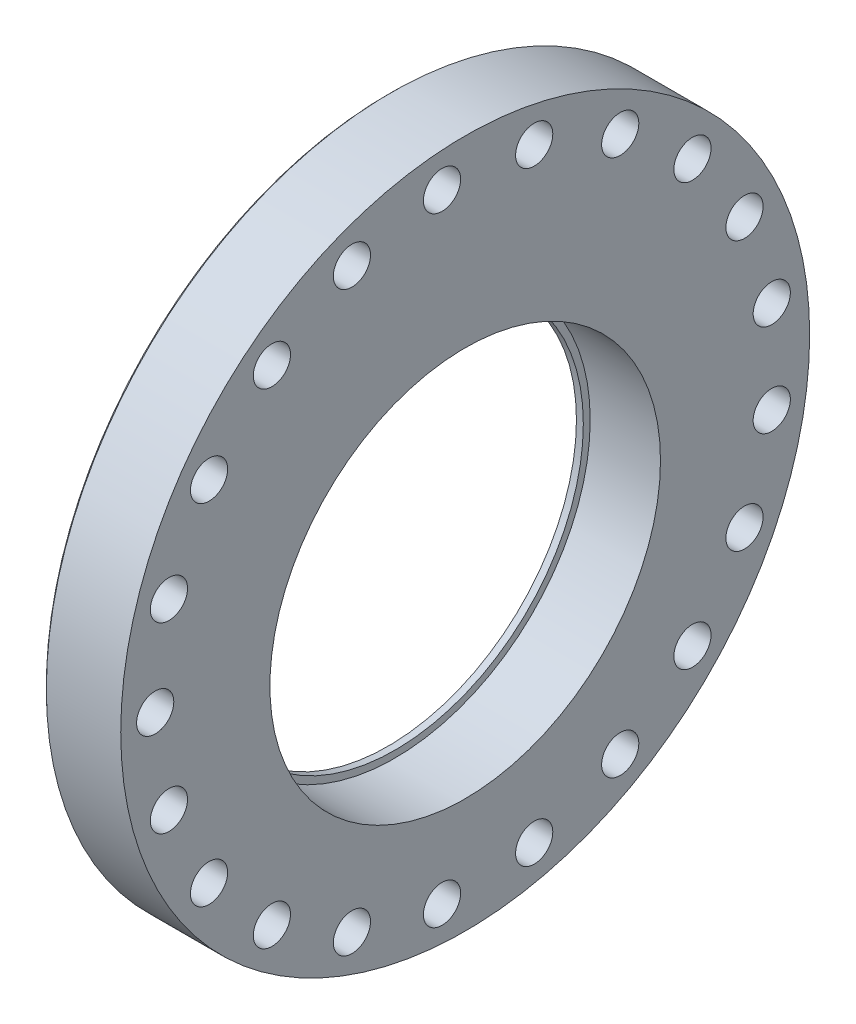
ISO-10303-21;
HEADER;
FILE_DESCRIPTION(('STEP AP214'),'2;1');
FILE_NAME('part.step','',(''),(''),'','','');
FILE_SCHEMA(('AUTOMOTIVE_DESIGN { 1 0 10303 214 1 1 1 1 }'));
ENDSEC;
DATA;
#1=APPLICATION_CONTEXT('core data for automotive mechanical design processes');
#2=APPLICATION_PROTOCOL_DEFINITION('international standard','automotive_design',2000,#1);
#3=PRODUCT_CONTEXT('',#1,'mechanical');
#4=PRODUCT('Part','Part','',(#3));
#5=PRODUCT_RELATED_PRODUCT_CATEGORY('part','',(#4));
#6=PRODUCT_DEFINITION_FORMATION('','',#4);
#7=PRODUCT_DEFINITION_CONTEXT('part definition',#1,'design');
#8=PRODUCT_DEFINITION('design','',#6,#7);
#9=PRODUCT_DEFINITION_SHAPE('','',#8);
#10=(LENGTH_UNIT() NAMED_UNIT(*) SI_UNIT(.MILLI.,.METRE.));
#11=(NAMED_UNIT(*) PLANE_ANGLE_UNIT() SI_UNIT($,.RADIAN.));
#12=(NAMED_UNIT(*) SI_UNIT($,.STERADIAN.) SOLID_ANGLE_UNIT());
#13=UNCERTAINTY_MEASURE_WITH_UNIT(LENGTH_MEASURE(1.E-05),#10,'distance_accuracy_value','');
#14=(GEOMETRIC_REPRESENTATION_CONTEXT(3) GLOBAL_UNCERTAINTY_ASSIGNED_CONTEXT((#13)) GLOBAL_UNIT_ASSIGNED_CONTEXT((#10,
#11,#12)) REPRESENTATION_CONTEXT('',''));
#15=CARTESIAN_POINT('',(0.,0.,0.));
#16=DIRECTION('',(0.,0.,1.));
#17=DIRECTION('',(1.,0.,0.));
#18=AXIS2_PLACEMENT_3D('',#15,#16,#17);
#19=CARTESIAN_POINT('',(14.224,227.166574262267,-762.669738747229));
#20=DIRECTION('',(-1.,0.,0.));
#21=DIRECTION('',(0.,0.,1.));
#22=AXIS2_PLACEMENT_3D('',#19,#20,#21);
#23=CYLINDRICAL_SURFACE('',#22,3.429);
#24=CARTESIAN_POINT('',(14.224,227.166574262267,-762.669738747229));
#25=DIRECTION('',(1.,0.,0.));
#26=DIRECTION('',(0.,0.,-1.));
#27=AXIS2_PLACEMENT_3D('',#24,#25,#26);
#28=CIRCLE('',#27,3.429);
#29=CARTESIAN_POINT('',(14.224,227.166574262267,-766.098738747229));
#30=VERTEX_POINT('',#29);
#31=EDGE_CURVE('E158',#30,#30,#28,.T.);
#32=ORIENTED_EDGE('',*,*,#31,.T.);
#33=EDGE_LOOP('',(#32));
#34=FACE_BOUND('',#33,.T.);
#35=CARTESIAN_POINT('',(0.,227.166574262267,-762.669738747229));
#36=DIRECTION('',(1.,0.,0.));
#37=DIRECTION('',(0.,0.,-1.));
#38=AXIS2_PLACEMENT_3D('',#35,#36,#37);
#39=CIRCLE('',#38,3.429);
#40=CARTESIAN_POINT('',(0.,227.166574262267,-766.098738747229));
#41=VERTEX_POINT('',#40);
#42=EDGE_CURVE('E69',#41,#41,#39,.T.);
#43=ORIENTED_EDGE('',*,*,#42,.F.);
#44=EDGE_LOOP('',(#43));
#45=FACE_BOUND('',#44,.T.);
#46=ADVANCED_FACE('F45',(#34,#45),#23,.F.);
#47=CARTESIAN_POINT('',(14.224,244.01183247985,-765.208752896551));
#48=DIRECTION('',(-1.,0.,0.));
#49=DIRECTION('',(0.,0.,1.));
#50=AXIS2_PLACEMENT_3D('',#47,#48,#49);
#51=CYLINDRICAL_SURFACE('',#50,3.42899999999977);
#52=CARTESIAN_POINT('',(14.224,244.01183247985,-765.208752896551));
#53=DIRECTION('',(1.,0.,0.));
#54=DIRECTION('',(0.,0.,-1.));
#55=AXIS2_PLACEMENT_3D('',#52,#53,#54);
#56=CIRCLE('',#55,3.42899999999977);
#57=CARTESIAN_POINT('',(14.224,244.01183247985,-768.637752896551));
#58=VERTEX_POINT('',#57);
#59=EDGE_CURVE('E162',#58,#58,#56,.T.);
#60=ORIENTED_EDGE('',*,*,#59,.T.);
#61=EDGE_LOOP('',(#60));
#62=FACE_BOUND('',#61,.T.);
#63=CARTESIAN_POINT('',(0.,244.01183247985,-765.208752896551));
#64=DIRECTION('',(1.,0.,0.));
#65=DIRECTION('',(0.,0.,-1.));
#66=AXIS2_PLACEMENT_3D('',#63,#64,#65);
#67=CIRCLE('',#66,3.42899999999977);
#68=CARTESIAN_POINT('',(0.,244.01183247985,-768.637752896551));
#69=VERTEX_POINT('',#68);
#70=EDGE_CURVE('E74',#69,#69,#67,.T.);
#71=ORIENTED_EDGE('',*,*,#70,.F.);
#72=EDGE_LOOP('',(#71));
#73=FACE_BOUND('',#72,.T.);
#74=ADVANCED_FACE('F266',(#62,#73),#51,.F.);
#75=CARTESIAN_POINT('',(14.224,259.360315580603,-772.60019279507));
#76=DIRECTION('',(-1.,0.,0.));
#77=DIRECTION('',(0.,0.,1.));
#78=AXIS2_PLACEMENT_3D('',#75,#76,#77);
#79=CYLINDRICAL_SURFACE('',#78,3.429);
#80=CARTESIAN_POINT('',(14.224,259.360315580603,-772.60019279507));
#81=DIRECTION('',(1.,0.,0.));
#82=DIRECTION('',(0.,0.,-1.));
#83=AXIS2_PLACEMENT_3D('',#80,#81,#82);
#84=CIRCLE('',#83,3.429);
#85=CARTESIAN_POINT('',(14.224,259.360315580603,-776.02919279507));
#86=VERTEX_POINT('',#85);
#87=EDGE_CURVE('E166',#86,#86,#84,.T.);
#88=ORIENTED_EDGE('',*,*,#87,.T.);
#89=EDGE_LOOP('',(#88));
#90=FACE_BOUND('',#89,.T.);
#91=CARTESIAN_POINT('',(0.,259.360315580603,-772.60019279507));
#92=DIRECTION('',(1.,0.,0.));
#93=DIRECTION('',(0.,0.,-1.));
#94=AXIS2_PLACEMENT_3D('',#91,#92,#93);
#95=CIRCLE('',#94,3.429);
#96=CARTESIAN_POINT('',(0.,259.360315580603,-776.02919279507));
#97=VERTEX_POINT('',#96);
#98=EDGE_CURVE('E78',#97,#97,#95,.T.);
#99=ORIENTED_EDGE('',*,*,#98,.F.);
#100=EDGE_LOOP('',(#99));
#101=FACE_BOUND('',#100,.T.);
#102=ADVANCED_FACE('F273',(#90,#101),#79,.F.);
#103=CARTESIAN_POINT('',(14.224,271.848243485315,-784.187296571003));
#104=DIRECTION('',(-1.,0.,0.));
#105=DIRECTION('',(0.,0.,1.));
#106=AXIS2_PLACEMENT_3D('',#103,#104,#105);
#107=CYLINDRICAL_SURFACE('',#106,3.42900000000023);
#108=CARTESIAN_POINT('',(14.224,271.848243485315,-784.187296571003));
#109=DIRECTION('',(1.,0.,0.));
#110=DIRECTION('',(0.,0.,-1.));
#111=AXIS2_PLACEMENT_3D('',#108,#109,#110);
#112=CIRCLE('',#111,3.42900000000023);
#113=CARTESIAN_POINT('',(14.224,271.848243485315,-787.616296571003));
#114=VERTEX_POINT('',#113);
#115=EDGE_CURVE('E170',#114,#114,#112,.T.);
#116=ORIENTED_EDGE('',*,*,#115,.T.);
#117=EDGE_LOOP('',(#116));
#118=FACE_BOUND('',#117,.T.);
#119=CARTESIAN_POINT('',(0.,271.848243485315,-784.187296571003));
#120=DIRECTION('',(1.,0.,0.));
#121=DIRECTION('',(0.,0.,-1.));
#122=AXIS2_PLACEMENT_3D('',#119,#120,#121);
#123=CIRCLE('',#122,3.42900000000023);
#124=CARTESIAN_POINT('',(0.,271.848243485315,-787.616296571003));
#125=VERTEX_POINT('',#124);
#126=EDGE_CURVE('E82',#125,#125,#123,.T.);
#127=ORIENTED_EDGE('',*,*,#126,.F.);
#128=EDGE_LOOP('',(#127));
#129=FACE_BOUND('',#128,.T.);
#130=ADVANCED_FACE('F283',(#118,#129),#107,.F.);
#131=CARTESIAN_POINT('',(14.224,280.366008997284,-798.94049920469));
#132=DIRECTION('',(-1.,0.,0.));
#133=DIRECTION('',(0.,0.,1.));
#134=AXIS2_PLACEMENT_3D('',#131,#132,#133);
#135=CYLINDRICAL_SURFACE('',#134,3.429);
#136=CARTESIAN_POINT('',(14.224,280.366008997284,-798.94049920469));
#137=DIRECTION('',(1.,0.,0.));
#138=DIRECTION('',(0.,0.,-1.));
#139=AXIS2_PLACEMENT_3D('',#136,#137,#138);
#140=CIRCLE('',#139,3.429);
#141=CARTESIAN_POINT('',(14.224,280.366008997284,-802.36949920469));
#142=VERTEX_POINT('',#141);
#143=EDGE_CURVE('E174',#142,#142,#140,.T.);
#144=ORIENTED_EDGE('',*,*,#143,.T.);
#145=EDGE_LOOP('',(#144));
#146=FACE_BOUND('',#145,.T.);
#147=CARTESIAN_POINT('',(0.,280.366008997284,-798.94049920469));
#148=DIRECTION('',(1.,0.,0.));
#149=DIRECTION('',(0.,0.,-1.));
#150=AXIS2_PLACEMENT_3D('',#147,#148,#149);
#151=CIRCLE('',#150,3.429);
#152=CARTESIAN_POINT('',(0.,280.366008997284,-802.36949920469));
#153=VERTEX_POINT('',#152);
#154=EDGE_CURVE('E86',#153,#153,#151,.T.);
#155=ORIENTED_EDGE('',*,*,#154,.F.);
#156=EDGE_LOOP('',(#155));
#157=FACE_BOUND('',#156,.T.);
#158=ADVANCED_FACE('F287',(#146,#157),#135,.F.);
#159=CARTESIAN_POINT('',(14.224,284.156771271172,-815.548913898765));
#160=DIRECTION('',(-1.,0.,0.));
#161=DIRECTION('',(0.,0.,1.));
#162=AXIS2_PLACEMENT_3D('',#159,#160,#161);
#163=CYLINDRICAL_SURFACE('',#162,3.42899999999977);
#164=CARTESIAN_POINT('',(14.224,284.156771271172,-815.548913898765));
#165=DIRECTION('',(1.,0.,0.));
#166=DIRECTION('',(0.,0.,-1.));
#167=AXIS2_PLACEMENT_3D('',#164,#165,#166);
#168=CIRCLE('',#167,3.42899999999977);
#169=CARTESIAN_POINT('',(14.224,284.156771271172,-818.977913898765));
#170=VERTEX_POINT('',#169);
#171=EDGE_CURVE('E178',#170,#170,#168,.T.);
#172=ORIENTED_EDGE('',*,*,#171,.T.);
#173=EDGE_LOOP('',(#172));
#174=FACE_BOUND('',#173,.T.);
#175=CARTESIAN_POINT('',(0.,284.156771271172,-815.548913898765));
#176=DIRECTION('',(1.,0.,0.));
#177=DIRECTION('',(0.,0.,-1.));
#178=AXIS2_PLACEMENT_3D('',#175,#176,#177);
#179=CIRCLE('',#178,3.42899999999977);
#180=CARTESIAN_POINT('',(0.,284.156771271172,-818.977913898765));
#181=VERTEX_POINT('',#180);
#182=EDGE_CURVE('E90',#181,#181,#179,.T.);
#183=ORIENTED_EDGE('',*,*,#182,.F.);
#184=EDGE_LOOP('',(#183));
#185=FACE_BOUND('',#184,.T.);
#186=ADVANCED_FACE('F291',(#174,#185),#163,.F.);
#187=CARTESIAN_POINT('',(14.224,282.883704443459,-832.536810122833));
#188=DIRECTION('',(-1.,0.,0.));
#189=DIRECTION('',(0.,0.,1.));
#190=AXIS2_PLACEMENT_3D('',#187,#188,#189);
#191=CYLINDRICAL_SURFACE('',#190,3.429);
#192=CARTESIAN_POINT('',(14.224,282.883704443459,-832.536810122833));
#193=DIRECTION('',(1.,0.,0.));
#194=DIRECTION('',(0.,0.,-1.));
#195=AXIS2_PLACEMENT_3D('',#192,#193,#194);
#196=CIRCLE('',#195,3.429);
#197=CARTESIAN_POINT('',(14.224,282.883704443459,-835.965810122833));
#198=VERTEX_POINT('',#197);
#199=EDGE_CURVE('E182',#198,#198,#196,.T.);
#200=ORIENTED_EDGE('',*,*,#199,.T.);
#201=EDGE_LOOP('',(#200));
#202=FACE_BOUND('',#201,.T.);
#203=CARTESIAN_POINT('',(0.,282.883704443459,-832.536810122833));
#204=DIRECTION('',(1.,0.,0.));
#205=DIRECTION('',(0.,0.,-1.));
#206=AXIS2_PLACEMENT_3D('',#203,#204,#205);
#207=CIRCLE('',#206,3.429);
#208=CARTESIAN_POINT('',(0.,282.883704443459,-835.965810122833));
#209=VERTEX_POINT('',#208);
#210=EDGE_CURVE('E94',#209,#209,#207,.T.);
#211=ORIENTED_EDGE('',*,*,#210,.F.);
#212=EDGE_LOOP('',(#211));
#213=FACE_BOUND('',#212,.T.);
#214=ADVANCED_FACE('F295',(#202,#213),#191,.F.);
#215=CARTESIAN_POINT('',(14.224,276.659926088548,-848.394738747229));
#216=DIRECTION('',(-1.,0.,0.));
#217=DIRECTION('',(0.,0.,1.));
#218=AXIS2_PLACEMENT_3D('',#215,#216,#217);
#219=CYLINDRICAL_SURFACE('',#218,3.42900000000012);
#220=CARTESIAN_POINT('',(14.224,276.659926088548,-848.394738747229));
#221=DIRECTION('',(1.,0.,0.));
#222=DIRECTION('',(0.,0.,-1.));
#223=AXIS2_PLACEMENT_3D('',#220,#221,#222);
#224=CIRCLE('',#223,3.42900000000012);
#225=CARTESIAN_POINT('',(14.224,276.659926088548,-851.82373874723));
#226=VERTEX_POINT('',#225);
#227=EDGE_CURVE('E186',#226,#226,#224,.T.);
#228=ORIENTED_EDGE('',*,*,#227,.T.);
#229=EDGE_LOOP('',(#228));
#230=FACE_BOUND('',#229,.T.);
#231=CARTESIAN_POINT('',(0.,276.659926088548,-848.394738747229));
#232=DIRECTION('',(1.,0.,0.));
#233=DIRECTION('',(0.,0.,-1.));
#234=AXIS2_PLACEMENT_3D('',#231,#232,#233);
#235=CIRCLE('',#234,3.42900000000012);
#236=CARTESIAN_POINT('',(0.,276.659926088548,-851.82373874723));
#237=VERTEX_POINT('',#236);
#238=EDGE_CURVE('E98',#237,#237,#235,.T.);
#239=ORIENTED_EDGE('',*,*,#238,.F.);
#240=EDGE_LOOP('',(#239));
#241=FACE_BOUND('',#240,.T.);
#242=ADVANCED_FACE('F299',(#230,#241),#219,.F.);
#243=CARTESIAN_POINT('',(14.224,266.038446225875,-861.713653222304));
#244=DIRECTION('',(-1.,0.,0.));
#245=DIRECTION('',(0.,0.,1.));
#246=AXIS2_PLACEMENT_3D('',#243,#244,#245);
#247=CYLINDRICAL_SURFACE('',#246,3.42899999999989);
#248=CARTESIAN_POINT('',(14.224,266.038446225875,-861.713653222304));
#249=DIRECTION('',(1.,0.,0.));
#250=DIRECTION('',(0.,0.,-1.));
#251=AXIS2_PLACEMENT_3D('',#248,#249,#250);
#252=CIRCLE('',#251,3.42899999999989);
#253=CARTESIAN_POINT('',(14.224,266.038446225875,-865.142653222304));
#254=VERTEX_POINT('',#253);
#255=EDGE_CURVE('E190',#254,#254,#252,.T.);
#256=ORIENTED_EDGE('',*,*,#255,.T.);
#257=EDGE_LOOP('',(#256));
#258=FACE_BOUND('',#257,.T.);
#259=CARTESIAN_POINT('',(0.,266.038446225875,-861.713653222304));
#260=DIRECTION('',(1.,0.,0.));
#261=DIRECTION('',(0.,0.,-1.));
#262=AXIS2_PLACEMENT_3D('',#259,#260,#261);
#263=CIRCLE('',#262,3.42899999999989);
#264=CARTESIAN_POINT('',(0.,266.038446225875,-865.142653222304));
#265=VERTEX_POINT('',#264);
#266=EDGE_CURVE('E102',#265,#265,#263,.T.);
#267=ORIENTED_EDGE('',*,*,#266,.F.);
#268=EDGE_LOOP('',(#267));
#269=FACE_BOUND('',#268,.T.);
#270=ADVANCED_FACE('F303',(#258,#269),#247,.F.);
#271=CARTESIAN_POINT('',(14.224,251.963029952836,-871.310109547853));
#272=DIRECTION('',(-1.,0.,0.));
#273=DIRECTION('',(0.,0.,1.));
#274=AXIS2_PLACEMENT_3D('',#271,#272,#273);
#275=CYLINDRICAL_SURFACE('',#274,3.429);
#276=CARTESIAN_POINT('',(14.224,251.963029952836,-871.310109547853));
#277=DIRECTION('',(1.,0.,0.));
#278=DIRECTION('',(0.,0.,-1.));
#279=AXIS2_PLACEMENT_3D('',#276,#277,#278);
#280=CIRCLE('',#279,3.429);
#281=CARTESIAN_POINT('',(14.224,251.963029952836,-874.739109547853));
#282=VERTEX_POINT('',#281);
#283=EDGE_CURVE('E194',#282,#282,#280,.T.);
#284=ORIENTED_EDGE('',*,*,#283,.T.);
#285=EDGE_LOOP('',(#284));
#286=FACE_BOUND('',#285,.T.);
#287=CARTESIAN_POINT('',(0.,251.963029952836,-871.310109547853));
#288=DIRECTION('',(1.,0.,0.));
#289=DIRECTION('',(0.,0.,-1.));
#290=AXIS2_PLACEMENT_3D('',#287,#288,#289);
#291=CIRCLE('',#290,3.429);
#292=CARTESIAN_POINT('',(0.,251.963029952836,-874.739109547853));
#293=VERTEX_POINT('',#292);
#294=EDGE_CURVE('E106',#293,#293,#291,.T.);
#295=ORIENTED_EDGE('',*,*,#294,.F.);
#296=EDGE_LOOP('',(#295));
#297=FACE_BOUND('',#296,.T.);
#298=ADVANCED_FACE('F307',(#286,#297),#275,.F.);
#299=CARTESIAN_POINT('',(14.224,235.684339774236,-876.331420465996));
#300=DIRECTION('',(-1.,0.,0.));
#301=DIRECTION('',(0.,0.,1.));
#302=AXIS2_PLACEMENT_3D('',#299,#300,#301);
#303=CYLINDRICAL_SURFACE('',#302,3.42899999999988);
#304=CARTESIAN_POINT('',(14.224,235.684339774236,-876.331420465996));
#305=DIRECTION('',(1.,0.,0.));
#306=DIRECTION('',(0.,0.,-1.));
#307=AXIS2_PLACEMENT_3D('',#304,#305,#306);
#308=CIRCLE('',#307,3.42899999999988);
#309=CARTESIAN_POINT('',(14.224,235.684339774236,-879.760420465996));
#310=VERTEX_POINT('',#309);
#311=EDGE_CURVE('E198',#310,#310,#308,.T.);
#312=ORIENTED_EDGE('',*,*,#311,.T.);
#313=EDGE_LOOP('',(#312));
#314=FACE_BOUND('',#313,.T.);
#315=CARTESIAN_POINT('',(0.,235.684339774236,-876.331420465996));
#316=DIRECTION('',(1.,0.,0.));
#317=DIRECTION('',(0.,0.,-1.));
#318=AXIS2_PLACEMENT_3D('',#315,#316,#317);
#319=CIRCLE('',#318,3.42899999999988);
#320=CARTESIAN_POINT('',(0.,235.684339774236,-879.760420465996));
#321=VERTEX_POINT('',#320);
#322=EDGE_CURVE('E110',#321,#321,#319,.T.);
#323=ORIENTED_EDGE('',*,*,#322,.F.);
#324=EDGE_LOOP('',(#323));
#325=FACE_BOUND('',#324,.T.);
#326=ADVANCED_FACE('F311',(#314,#325),#303,.F.);
#327=CARTESIAN_POINT('',(14.224,218.648808750299,-876.331420465995));
#328=DIRECTION('',(-1.,0.,0.));
#329=DIRECTION('',(0.,0.,1.));
#330=AXIS2_PLACEMENT_3D('',#327,#328,#329);
#331=CYLINDRICAL_SURFACE('',#330,3.42899999999977);
#332=CARTESIAN_POINT('',(14.224,218.648808750299,-876.331420465995));
#333=DIRECTION('',(1.,0.,0.));
#334=DIRECTION('',(0.,0.,-1.));
#335=AXIS2_PLACEMENT_3D('',#332,#333,#334);
#336=CIRCLE('',#335,3.42899999999977);
#337=CARTESIAN_POINT('',(14.224,218.648808750299,-879.760420465995));
#338=VERTEX_POINT('',#337);
#339=EDGE_CURVE('E202',#338,#338,#336,.T.);
#340=ORIENTED_EDGE('',*,*,#339,.T.);
#341=EDGE_LOOP('',(#340));
#342=FACE_BOUND('',#341,.T.);
#343=CARTESIAN_POINT('',(0.,218.648808750299,-876.331420465995));
#344=DIRECTION('',(1.,0.,0.));
#345=DIRECTION('',(0.,0.,-1.));
#346=AXIS2_PLACEMENT_3D('',#343,#344,#345);
#347=CIRCLE('',#346,3.42899999999977);
#348=CARTESIAN_POINT('',(0.,218.648808750299,-879.760420465995));
#349=VERTEX_POINT('',#348);
#350=EDGE_CURVE('E114',#349,#349,#347,.T.);
#351=ORIENTED_EDGE('',*,*,#350,.F.);
#352=EDGE_LOOP('',(#351));
#353=FACE_BOUND('',#352,.T.);
#354=ADVANCED_FACE('F315',(#342,#353),#331,.F.);
#355=CARTESIAN_POINT('',(14.224,202.370118571699,-871.310109547852));
#356=DIRECTION('',(-1.,0.,0.));
#357=DIRECTION('',(0.,0.,1.));
#358=AXIS2_PLACEMENT_3D('',#355,#356,#357);
#359=CYLINDRICAL_SURFACE('',#358,3.42900000000012);
#360=CARTESIAN_POINT('',(14.224,202.370118571699,-871.310109547852));
#361=DIRECTION('',(1.,0.,0.));
#362=DIRECTION('',(0.,0.,-1.));
#363=AXIS2_PLACEMENT_3D('',#360,#361,#362);
#364=CIRCLE('',#363,3.42900000000012);
#365=CARTESIAN_POINT('',(14.224,202.370118571699,-874.739109547853));
#366=VERTEX_POINT('',#365);
#367=EDGE_CURVE('E206',#366,#366,#364,.T.);
#368=ORIENTED_EDGE('',*,*,#367,.T.);
#369=EDGE_LOOP('',(#368));
#370=FACE_BOUND('',#369,.T.);
#371=CARTESIAN_POINT('',(0.,202.370118571699,-871.310109547852));
#372=DIRECTION('',(1.,0.,0.));
#373=DIRECTION('',(0.,0.,-1.));
#374=AXIS2_PLACEMENT_3D('',#371,#372,#373);
#375=CIRCLE('',#374,3.42900000000012);
#376=CARTESIAN_POINT('',(0.,202.370118571699,-874.739109547853));
#377=VERTEX_POINT('',#376);
#378=EDGE_CURVE('E118',#377,#377,#375,.T.);
#379=ORIENTED_EDGE('',*,*,#378,.F.);
#380=EDGE_LOOP('',(#379));
#381=FACE_BOUND('',#380,.T.);
#382=ADVANCED_FACE('F319',(#370,#381),#359,.F.);
#383=CARTESIAN_POINT('',(14.224,188.294702298659,-861.713653222304));
#384=DIRECTION('',(-1.,0.,0.));
#385=DIRECTION('',(0.,0.,1.));
#386=AXIS2_PLACEMENT_3D('',#383,#384,#385);
#387=CYLINDRICAL_SURFACE('',#386,3.42900000000012);
#388=CARTESIAN_POINT('',(14.224,188.294702298659,-861.713653222304));
#389=DIRECTION('',(1.,0.,0.));
#390=DIRECTION('',(0.,0.,-1.));
#391=AXIS2_PLACEMENT_3D('',#388,#389,#390);
#392=CIRCLE('',#391,3.42900000000012);
#393=CARTESIAN_POINT('',(14.224,188.294702298659,-865.142653222304));
#394=VERTEX_POINT('',#393);
#395=EDGE_CURVE('E210',#394,#394,#392,.T.);
#396=ORIENTED_EDGE('',*,*,#395,.T.);
#397=EDGE_LOOP('',(#396));
#398=FACE_BOUND('',#397,.T.);
#399=CARTESIAN_POINT('',(0.,188.294702298659,-861.713653222304));
#400=DIRECTION('',(1.,0.,0.));
#401=DIRECTION('',(0.,0.,-1.));
#402=AXIS2_PLACEMENT_3D('',#399,#400,#401);
#403=CIRCLE('',#402,3.42900000000012);
#404=CARTESIAN_POINT('',(0.,188.294702298659,-865.142653222304));
#405=VERTEX_POINT('',#404);
#406=EDGE_CURVE('E122',#405,#405,#403,.T.);
#407=ORIENTED_EDGE('',*,*,#406,.F.);
#408=EDGE_LOOP('',(#407));
#409=FACE_BOUND('',#408,.T.);
#410=ADVANCED_FACE('F323',(#398,#409),#387,.F.);
#411=CARTESIAN_POINT('',(14.224,177.673222435986,-848.394738747229));
#412=DIRECTION('',(-1.,0.,0.));
#413=DIRECTION('',(0.,0.,1.));
#414=AXIS2_PLACEMENT_3D('',#411,#412,#413);
#415=CYLINDRICAL_SURFACE('',#414,3.429);
#416=CARTESIAN_POINT('',(14.224,177.673222435986,-848.394738747229));
#417=DIRECTION('',(1.,0.,0.));
#418=DIRECTION('',(0.,0.,-1.));
#419=AXIS2_PLACEMENT_3D('',#416,#417,#418);
#420=CIRCLE('',#419,3.429);
#421=CARTESIAN_POINT('',(14.224,177.673222435986,-851.823738747229));
#422=VERTEX_POINT('',#421);
#423=EDGE_CURVE('E214',#422,#422,#420,.T.);
#424=ORIENTED_EDGE('',*,*,#423,.T.);
#425=EDGE_LOOP('',(#424));
#426=FACE_BOUND('',#425,.T.);
#427=CARTESIAN_POINT('',(0.,177.673222435986,-848.394738747229));
#428=DIRECTION('',(1.,0.,0.));
#429=DIRECTION('',(0.,0.,-1.));
#430=AXIS2_PLACEMENT_3D('',#427,#428,#429);
#431=CIRCLE('',#430,3.429);
#432=CARTESIAN_POINT('',(0.,177.673222435986,-851.823738747229));
#433=VERTEX_POINT('',#432);
#434=EDGE_CURVE('E126',#433,#433,#431,.T.);
#435=ORIENTED_EDGE('',*,*,#434,.F.);
#436=EDGE_LOOP('',(#435));
#437=FACE_BOUND('',#436,.T.);
#438=ADVANCED_FACE('F327',(#426,#437),#415,.F.);
#439=CARTESIAN_POINT('',(14.224,171.449444081076,-832.536810122833));
#440=DIRECTION('',(-1.,0.,0.));
#441=DIRECTION('',(0.,0.,1.));
#442=AXIS2_PLACEMENT_3D('',#439,#440,#441);
#443=CYLINDRICAL_SURFACE('',#442,3.429);
#444=CARTESIAN_POINT('',(14.224,171.449444081076,-832.536810122833));
#445=DIRECTION('',(1.,0.,0.));
#446=DIRECTION('',(0.,0.,-1.));
#447=AXIS2_PLACEMENT_3D('',#444,#445,#446);
#448=CIRCLE('',#447,3.429);
#449=CARTESIAN_POINT('',(14.224,171.449444081076,-835.965810122833));
#450=VERTEX_POINT('',#449);
#451=EDGE_CURVE('E218',#450,#450,#448,.T.);
#452=ORIENTED_EDGE('',*,*,#451,.T.);
#453=EDGE_LOOP('',(#452));
#454=FACE_BOUND('',#453,.T.);
#455=CARTESIAN_POINT('',(0.,171.449444081076,-832.536810122833));
#456=DIRECTION('',(1.,0.,0.));
#457=DIRECTION('',(0.,0.,-1.));
#458=AXIS2_PLACEMENT_3D('',#455,#456,#457);
#459=CIRCLE('',#458,3.429);
#460=CARTESIAN_POINT('',(0.,171.449444081076,-835.965810122833));
#461=VERTEX_POINT('',#460);
#462=EDGE_CURVE('E130',#461,#461,#459,.T.);
#463=ORIENTED_EDGE('',*,*,#462,.F.);
#464=EDGE_LOOP('',(#463));
#465=FACE_BOUND('',#464,.T.);
#466=ADVANCED_FACE('F331',(#454,#465),#443,.F.);
#467=CARTESIAN_POINT('',(14.224,170.176377253363,-815.548913898765));
#468=DIRECTION('',(-1.,0.,0.));
#469=DIRECTION('',(0.,0.,1.));
#470=AXIS2_PLACEMENT_3D('',#467,#468,#469);
#471=CYLINDRICAL_SURFACE('',#470,3.42899999999988);
#472=CARTESIAN_POINT('',(14.224,170.176377253363,-815.548913898765));
#473=DIRECTION('',(1.,0.,0.));
#474=DIRECTION('',(0.,0.,-1.));
#475=AXIS2_PLACEMENT_3D('',#472,#473,#474);
#476=CIRCLE('',#475,3.42899999999988);
#477=CARTESIAN_POINT('',(14.224,170.176377253363,-818.977913898765));
#478=VERTEX_POINT('',#477);
#479=EDGE_CURVE('E222',#478,#478,#476,.T.);
#480=ORIENTED_EDGE('',*,*,#479,.T.);
#481=EDGE_LOOP('',(#480));
#482=FACE_BOUND('',#481,.T.);
#483=CARTESIAN_POINT('',(0.,170.176377253363,-815.548913898765));
#484=DIRECTION('',(1.,0.,0.));
#485=DIRECTION('',(0.,0.,-1.));
#486=AXIS2_PLACEMENT_3D('',#483,#484,#485);
#487=CIRCLE('',#486,3.42899999999988);
#488=CARTESIAN_POINT('',(0.,170.176377253363,-818.977913898765));
#489=VERTEX_POINT('',#488);
#490=EDGE_CURVE('E134',#489,#489,#487,.T.);
#491=ORIENTED_EDGE('',*,*,#490,.F.);
#492=EDGE_LOOP('',(#491));
#493=FACE_BOUND('',#492,.T.);
#494=ADVANCED_FACE('F335',(#482,#493),#471,.F.);
#495=CARTESIAN_POINT('',(14.224,173.967139527251,-798.94049920469));
#496=DIRECTION('',(-1.,0.,0.));
#497=DIRECTION('',(0.,0.,1.));
#498=AXIS2_PLACEMENT_3D('',#495,#496,#497);
#499=CYLINDRICAL_SURFACE('',#498,3.42899999999988);
#500=CARTESIAN_POINT('',(14.224,173.967139527251,-798.94049920469));
#501=DIRECTION('',(1.,0.,0.));
#502=DIRECTION('',(0.,0.,-1.));
#503=AXIS2_PLACEMENT_3D('',#500,#501,#502);
#504=CIRCLE('',#503,3.42899999999988);
#505=CARTESIAN_POINT('',(14.224,173.967139527251,-802.36949920469));
#506=VERTEX_POINT('',#505);
#507=EDGE_CURVE('E226',#506,#506,#504,.T.);
#508=ORIENTED_EDGE('',*,*,#507,.T.);
#509=EDGE_LOOP('',(#508));
#510=FACE_BOUND('',#509,.T.);
#511=CARTESIAN_POINT('',(0.,173.967139527251,-798.94049920469));
#512=DIRECTION('',(1.,0.,0.));
#513=DIRECTION('',(0.,0.,-1.));
#514=AXIS2_PLACEMENT_3D('',#511,#512,#513);
#515=CIRCLE('',#514,3.42899999999988);
#516=CARTESIAN_POINT('',(0.,173.967139527251,-802.36949920469));
#517=VERTEX_POINT('',#516);
#518=EDGE_CURVE('E138',#517,#517,#515,.T.);
#519=ORIENTED_EDGE('',*,*,#518,.F.);
#520=EDGE_LOOP('',(#519));
#521=FACE_BOUND('',#520,.T.);
#522=ADVANCED_FACE('F339',(#510,#521),#499,.F.);
#523=CARTESIAN_POINT('',(14.224,220.816574262267,-819.819738747229));
#524=DIRECTION('',(-1.,0.,0.));
#525=DIRECTION('',(0.,0.,1.));
#526=AXIS2_PLACEMENT_3D('',#523,#524,#525);
#527=CYLINDRICAL_SURFACE('',#526,36.0000550000001);
#528=CARTESIAN_POINT('',(1.27,220.816574262267,-819.819738747229));
#529=DIRECTION('',(1.,0.,0.));
#530=DIRECTION('',(0.,0.,-1.));
#531=AXIS2_PLACEMENT_3D('',#528,#529,#530);
#532=CIRCLE('',#531,36.0000550000001);
#533=CARTESIAN_POINT('',(1.27,220.816574262267,-855.819793747229));
#534=VERTEX_POINT('',#533);
#535=EDGE_CURVE('E10',#534,#534,#532,.T.);
#536=ORIENTED_EDGE('',*,*,#535,.F.);
#537=EDGE_LOOP('',(#536));
#538=FACE_BOUND('',#537,.T.);
#539=CARTESIAN_POINT('',(14.224,220.816574262267,-819.819738747229));
#540=DIRECTION('',(1.,0.,0.));
#541=DIRECTION('',(0.,0.,-1.));
#542=AXIS2_PLACEMENT_3D('',#539,#540,#541);
#543=CIRCLE('',#542,36.0000550000001);
#544=CARTESIAN_POINT('',(14.224,220.816574262267,-855.819793747229));
#545=VERTEX_POINT('',#544);
#546=EDGE_CURVE('E230',#545,#545,#543,.T.);
#547=ORIENTED_EDGE('',*,*,#546,.T.);
#548=EDGE_LOOP('',(#547));
#549=FACE_BOUND('',#548,.T.);
#550=ADVANCED_FACE('F343',(#538,#549),#527,.F.);
#551=CARTESIAN_POINT('',(14.224,182.484905039219,-784.187296571003));
#552=DIRECTION('',(-1.,0.,0.));
#553=DIRECTION('',(0.,0.,1.));
#554=AXIS2_PLACEMENT_3D('',#551,#552,#553);
#555=CYLINDRICAL_SURFACE('',#554,3.42899999999988);
#556=CARTESIAN_POINT('',(14.224,182.484905039219,-784.187296571003));
#557=DIRECTION('',(1.,0.,0.));
#558=DIRECTION('',(0.,0.,-1.));
#559=AXIS2_PLACEMENT_3D('',#556,#557,#558);
#560=CIRCLE('',#559,3.42899999999988);
#561=CARTESIAN_POINT('',(14.224,182.484905039219,-787.616296571003));
#562=VERTEX_POINT('',#561);
#563=EDGE_CURVE('E234',#562,#562,#560,.T.);
#564=ORIENTED_EDGE('',*,*,#563,.T.);
#565=EDGE_LOOP('',(#564));
#566=FACE_BOUND('',#565,.T.);
#567=CARTESIAN_POINT('',(0.,182.484905039219,-784.187296571003));
#568=DIRECTION('',(1.,0.,0.));
#569=DIRECTION('',(0.,0.,-1.));
#570=AXIS2_PLACEMENT_3D('',#567,#568,#569);
#571=CIRCLE('',#570,3.42899999999988);
#572=CARTESIAN_POINT('',(0.,182.484905039219,-787.616296571003));
#573=VERTEX_POINT('',#572);
#574=EDGE_CURVE('E142',#573,#573,#571,.T.);
#575=ORIENTED_EDGE('',*,*,#574,.F.);
#576=EDGE_LOOP('',(#575));
#577=FACE_BOUND('',#576,.T.);
#578=ADVANCED_FACE('F347',(#566,#577),#555,.F.);
#579=CARTESIAN_POINT('',(14.224,194.972832943931,-772.60019279507));
#580=DIRECTION('',(-1.,0.,0.));
#581=DIRECTION('',(0.,0.,1.));
#582=AXIS2_PLACEMENT_3D('',#579,#580,#581);
#583=CYLINDRICAL_SURFACE('',#582,3.429);
#584=CARTESIAN_POINT('',(14.224,194.972832943931,-772.60019279507));
#585=DIRECTION('',(1.,0.,0.));
#586=DIRECTION('',(0.,0.,-1.));
#587=AXIS2_PLACEMENT_3D('',#584,#585,#586);
#588=CIRCLE('',#587,3.429);
#589=CARTESIAN_POINT('',(14.224,194.972832943931,-776.02919279507));
#590=VERTEX_POINT('',#589);
#591=EDGE_CURVE('E238',#590,#590,#588,.T.);
#592=ORIENTED_EDGE('',*,*,#591,.T.);
#593=EDGE_LOOP('',(#592));
#594=FACE_BOUND('',#593,.T.);
#595=CARTESIAN_POINT('',(0.,194.972832943931,-772.60019279507));
#596=DIRECTION('',(1.,0.,0.));
#597=DIRECTION('',(0.,0.,-1.));
#598=AXIS2_PLACEMENT_3D('',#595,#596,#597);
#599=CIRCLE('',#598,3.429);
#600=CARTESIAN_POINT('',(0.,194.972832943931,-776.02919279507));
#601=VERTEX_POINT('',#600);
#602=EDGE_CURVE('E146',#601,#601,#599,.T.);
#603=ORIENTED_EDGE('',*,*,#602,.F.);
#604=EDGE_LOOP('',(#603));
#605=FACE_BOUND('',#604,.T.);
#606=ADVANCED_FACE('F351',(#594,#605),#583,.F.);
#607=CARTESIAN_POINT('',(14.224,210.321316044684,-765.208752896551));
#608=DIRECTION('',(-1.,0.,0.));
#609=DIRECTION('',(0.,0.,1.));
#610=AXIS2_PLACEMENT_3D('',#607,#608,#609);
#611=CYLINDRICAL_SURFACE('',#610,3.42900000000012);
#612=CARTESIAN_POINT('',(14.224,210.321316044684,-765.208752896551));
#613=DIRECTION('',(1.,0.,0.));
#614=DIRECTION('',(0.,0.,-1.));
#615=AXIS2_PLACEMENT_3D('',#612,#613,#614);
#616=CIRCLE('',#615,3.42900000000012);
#617=CARTESIAN_POINT('',(14.224,210.321316044684,-768.637752896551));
#618=VERTEX_POINT('',#617);
#619=EDGE_CURVE('E73',#618,#618,#616,.T.);
#620=ORIENTED_EDGE('',*,*,#619,.T.);
#621=EDGE_LOOP('',(#620));
#622=FACE_BOUND('',#621,.T.);
#623=CARTESIAN_POINT('',(0.,210.321316044684,-765.208752896551));
#624=DIRECTION('',(1.,0.,0.));
#625=DIRECTION('',(0.,0.,-1.));
#626=AXIS2_PLACEMENT_3D('',#623,#624,#625);
#627=CIRCLE('',#626,3.42900000000012);
#628=CARTESIAN_POINT('',(0.,210.321316044684,-768.637752896551));
#629=VERTEX_POINT('',#628);
#630=EDGE_CURVE('E150',#629,#629,#627,.T.);
#631=ORIENTED_EDGE('',*,*,#630,.F.);
#632=EDGE_LOOP('',(#631));
#633=FACE_BOUND('',#632,.T.);
#634=ADVANCED_FACE('F354',(#622,#633),#611,.F.);
#635=CARTESIAN_POINT('',(14.224,227.166574262267,-819.819738747229));
#636=DIRECTION('',(-1.,0.,0.));
#637=DIRECTION('',(0.,0.,1.));
#638=AXIS2_PLACEMENT_3D('',#635,#636,#637);
#639=CYLINDRICAL_SURFACE('',#638,63.5);
#640=CARTESIAN_POINT('',(0.50799999999987,227.166574262267,-819.819738747229));
#641=DIRECTION('',(1.,0.,0.));
#642=DIRECTION('',(0.,0.,-1.));
#643=AXIS2_PLACEMENT_3D('',#640,#641,#642);
#644=CIRCLE('',#643,63.5);
#645=CARTESIAN_POINT('',(0.50799999999987,227.166574262267,-883.319738747229));
#646=VERTEX_POINT('',#645);
#647=EDGE_CURVE('E60',#646,#646,#644,.T.);
#648=ORIENTED_EDGE('',*,*,#647,.T.);
#649=EDGE_LOOP('',(#648));
#650=FACE_BOUND('',#649,.T.);
#651=CARTESIAN_POINT('',(14.224,227.166574262267,-819.819738747229));
#652=DIRECTION('',(1.,0.,0.));
#653=DIRECTION('',(0.,0.,-1.));
#654=AXIS2_PLACEMENT_3D('',#651,#652,#653);
#655=CIRCLE('',#654,63.5);
#656=CARTESIAN_POINT('',(14.224,227.166574262267,-883.319738747229));
#657=VERTEX_POINT('',#656);
#658=EDGE_CURVE('E66',#657,#657,#655,.T.);
#659=ORIENTED_EDGE('',*,*,#658,.F.);
#660=EDGE_LOOP('',(#659));
#661=FACE_BOUND('',#660,.T.);
#662=ADVANCED_FACE('F278',(#650,#661),#639,.T.);
#663=CARTESIAN_POINT('',(14.224,0.,0.));
#664=DIRECTION('',(1.,0.,0.));
#665=DIRECTION('',(0.,0.,-1.));
#666=AXIS2_PLACEMENT_3D('',#663,#664,#665);
#667=PLANE('',#666);
#668=ORIENTED_EDGE('',*,*,#619,.F.);
#669=EDGE_LOOP('',(#668));
#670=FACE_BOUND('',#669,.T.);
#671=ORIENTED_EDGE('',*,*,#591,.F.);
#672=EDGE_LOOP('',(#671));
#673=FACE_BOUND('',#672,.T.);
#674=ORIENTED_EDGE('',*,*,#563,.F.);
#675=EDGE_LOOP('',(#674));
#676=FACE_BOUND('',#675,.T.);
#677=ORIENTED_EDGE('',*,*,#546,.F.);
#678=EDGE_LOOP('',(#677));
#679=FACE_BOUND('',#678,.T.);
#680=ORIENTED_EDGE('',*,*,#507,.F.);
#681=EDGE_LOOP('',(#680));
#682=FACE_BOUND('',#681,.T.);
#683=ORIENTED_EDGE('',*,*,#479,.F.);
#684=EDGE_LOOP('',(#683));
#685=FACE_BOUND('',#684,.T.);
#686=ORIENTED_EDGE('',*,*,#451,.F.);
#687=EDGE_LOOP('',(#686));
#688=FACE_BOUND('',#687,.T.);
#689=ORIENTED_EDGE('',*,*,#423,.F.);
#690=EDGE_LOOP('',(#689));
#691=FACE_BOUND('',#690,.T.);
#692=ORIENTED_EDGE('',*,*,#395,.F.);
#693=EDGE_LOOP('',(#692));
#694=FACE_BOUND('',#693,.T.);
#695=ORIENTED_EDGE('',*,*,#367,.F.);
#696=EDGE_LOOP('',(#695));
#697=FACE_BOUND('',#696,.T.);
#698=ORIENTED_EDGE('',*,*,#339,.F.);
#699=EDGE_LOOP('',(#698));
#700=FACE_BOUND('',#699,.T.);
#701=ORIENTED_EDGE('',*,*,#311,.F.);
#702=EDGE_LOOP('',(#701));
#703=FACE_BOUND('',#702,.T.);
#704=ORIENTED_EDGE('',*,*,#283,.F.);
#705=EDGE_LOOP('',(#704));
#706=FACE_BOUND('',#705,.T.);
#707=ORIENTED_EDGE('',*,*,#255,.F.);
#708=EDGE_LOOP('',(#707));
#709=FACE_BOUND('',#708,.T.);
#710=ORIENTED_EDGE('',*,*,#227,.F.);
#711=EDGE_LOOP('',(#710));
#712=FACE_BOUND('',#711,.T.);
#713=ORIENTED_EDGE('',*,*,#199,.F.);
#714=EDGE_LOOP('',(#713));
#715=FACE_BOUND('',#714,.T.);
#716=ORIENTED_EDGE('',*,*,#171,.F.);
#717=EDGE_LOOP('',(#716));
#718=FACE_BOUND('',#717,.T.);
#719=ORIENTED_EDGE('',*,*,#143,.F.);
#720=EDGE_LOOP('',(#719));
#721=FACE_BOUND('',#720,.T.);
#722=ORIENTED_EDGE('',*,*,#115,.F.);
#723=EDGE_LOOP('',(#722));
#724=FACE_BOUND('',#723,.T.);
#725=ORIENTED_EDGE('',*,*,#87,.F.);
#726=EDGE_LOOP('',(#725));
#727=FACE_BOUND('',#726,.T.);
#728=ORIENTED_EDGE('',*,*,#59,.F.);
#729=EDGE_LOOP('',(#728));
#730=FACE_BOUND('',#729,.T.);
#731=ORIENTED_EDGE('',*,*,#31,.F.);
#732=EDGE_LOOP('',(#731));
#733=FACE_BOUND('',#732,.T.);
#734=ORIENTED_EDGE('',*,*,#658,.T.);
#735=EDGE_LOOP('',(#734));
#736=FACE_BOUND('',#735,.T.);
#737=ADVANCED_FACE('F362',(#670,#673,#676,#679,#682,#685,#688,#691,#694,#697,#700,#703,#706,
#709,#712,#715,#718,#721,#724,#727,#730,#733,#736),#667,.T.);
#738=CARTESIAN_POINT('',(0.,0.,0.));
#739=DIRECTION('',(1.,0.,0.));
#740=DIRECTION('',(0.,0.,-1.));
#741=AXIS2_PLACEMENT_3D('',#738,#739,#740);
#742=PLANE('',#741);
#743=CARTESIAN_POINT('',(0.,227.166574262267,-819.819738747229));
#744=DIRECTION('',(1.,0.,0.));
#745=DIRECTION('',(0.,0.,-1.));
#746=AXIS2_PLACEMENT_3D('',#743,#744,#745);
#747=CIRCLE('',#746,62.992);
#748=CARTESIAN_POINT('',(0.,227.166574262267,-882.811738747229));
#749=VERTEX_POINT('',#748);
#750=EDGE_CURVE('E54',#749,#749,#747,.F.);
#751=ORIENTED_EDGE('',*,*,#750,.T.);
#752=EDGE_LOOP('',(#751));
#753=FACE_BOUND('',#752,.T.);
#754=ORIENTED_EDGE('',*,*,#630,.T.);
#755=EDGE_LOOP('',(#754));
#756=FACE_BOUND('',#755,.T.);
#757=ORIENTED_EDGE('',*,*,#602,.T.);
#758=EDGE_LOOP('',(#757));
#759=FACE_BOUND('',#758,.T.);
#760=ORIENTED_EDGE('',*,*,#574,.T.);
#761=EDGE_LOOP('',(#760));
#762=FACE_BOUND('',#761,.T.);
#763=ORIENTED_EDGE('',*,*,#518,.T.);
#764=EDGE_LOOP('',(#763));
#765=FACE_BOUND('',#764,.T.);
#766=ORIENTED_EDGE('',*,*,#490,.T.);
#767=EDGE_LOOP('',(#766));
#768=FACE_BOUND('',#767,.T.);
#769=ORIENTED_EDGE('',*,*,#462,.T.);
#770=EDGE_LOOP('',(#769));
#771=FACE_BOUND('',#770,.T.);
#772=ORIENTED_EDGE('',*,*,#434,.T.);
#773=EDGE_LOOP('',(#772));
#774=FACE_BOUND('',#773,.T.);
#775=ORIENTED_EDGE('',*,*,#406,.T.);
#776=EDGE_LOOP('',(#775));
#777=FACE_BOUND('',#776,.T.);
#778=ORIENTED_EDGE('',*,*,#378,.T.);
#779=EDGE_LOOP('',(#778));
#780=FACE_BOUND('',#779,.T.);
#781=ORIENTED_EDGE('',*,*,#350,.T.);
#782=EDGE_LOOP('',(#781));
#783=FACE_BOUND('',#782,.T.);
#784=ORIENTED_EDGE('',*,*,#322,.T.);
#785=EDGE_LOOP('',(#784));
#786=FACE_BOUND('',#785,.T.);
#787=ORIENTED_EDGE('',*,*,#294,.T.);
#788=EDGE_LOOP('',(#787));
#789=FACE_BOUND('',#788,.T.);
#790=ORIENTED_EDGE('',*,*,#266,.T.);
#791=EDGE_LOOP('',(#790));
#792=FACE_BOUND('',#791,.T.);
#793=ORIENTED_EDGE('',*,*,#238,.T.);
#794=EDGE_LOOP('',(#793));
#795=FACE_BOUND('',#794,.T.);
#796=ORIENTED_EDGE('',*,*,#210,.T.);
#797=EDGE_LOOP('',(#796));
#798=FACE_BOUND('',#797,.T.);
#799=ORIENTED_EDGE('',*,*,#182,.T.);
#800=EDGE_LOOP('',(#799));
#801=FACE_BOUND('',#800,.T.);
#802=ORIENTED_EDGE('',*,*,#154,.T.);
#803=EDGE_LOOP('',(#802));
#804=FACE_BOUND('',#803,.T.);
#805=ORIENTED_EDGE('',*,*,#126,.T.);
#806=EDGE_LOOP('',(#805));
#807=FACE_BOUND('',#806,.T.);
#808=ORIENTED_EDGE('',*,*,#98,.T.);
#809=EDGE_LOOP('',(#808));
#810=FACE_BOUND('',#809,.T.);
#811=ORIENTED_EDGE('',*,*,#70,.T.);
#812=EDGE_LOOP('',(#811));
#813=FACE_BOUND('',#812,.T.);
#814=ORIENTED_EDGE('',*,*,#42,.T.);
#815=EDGE_LOOP('',(#814));
#816=FACE_BOUND('',#815,.T.);
#817=CARTESIAN_POINT('',(0.,220.816574262267,-819.819738747229));
#818=DIRECTION('',(1.,0.,0.));
#819=DIRECTION('',(0.,0.,-1.));
#820=AXIS2_PLACEMENT_3D('',#817,#818,#819);
#821=CIRCLE('',#820,34.730055);
#822=CARTESIAN_POINT('',(0.,220.816574262267,-854.549793747229));
#823=VERTEX_POINT('',#822);
#824=EDGE_CURVE('E245',#823,#823,#821,.T.);
#825=ORIENTED_EDGE('',*,*,#824,.T.);
#826=EDGE_LOOP('',(#825));
#827=FACE_BOUND('',#826,.T.);
#828=ADVANCED_FACE('F368',(#753,#756,#759,#762,#765,#768,#771,#774,#777,#780,#783,#786,#789,
#792,#795,#798,#801,#804,#807,#810,#813,#816,#827),#742,.F.);
#829=CARTESIAN_POINT('',(0.50799999999987,227.166574262267,-819.819738747229));
#830=DIRECTION('',(1.,0.,0.));
#831=DIRECTION('',(0.,0.,-1.));
#832=AXIS2_PLACEMENT_3D('',#829,#830,#831);
#833=CONICAL_SURFACE('',#832,63.5,0.785398163397489);
#834=ORIENTED_EDGE('',*,*,#750,.F.);
#835=EDGE_LOOP('',(#834));
#836=FACE_BOUND('',#835,.T.);
#837=ORIENTED_EDGE('',*,*,#647,.F.);
#838=EDGE_LOOP('',(#837));
#839=FACE_BOUND('',#838,.T.);
#840=ADVANCED_FACE('F48',(#836,#839),#833,.T.);
#841=CARTESIAN_POINT('',(1.27,220.816574262267,-819.819738747229));
#842=DIRECTION('',(-1.,0.,0.));
#843=DIRECTION('',(0.,0.,1.));
#844=AXIS2_PLACEMENT_3D('',#841,#842,#843);
#845=CYLINDRICAL_SURFACE('',#844,34.730055);
#846=CARTESIAN_POINT('',(1.27,220.816574262267,-819.819738747229));
#847=DIRECTION('',(1.,0.,0.));
#848=DIRECTION('',(0.,0.,-1.));
#849=AXIS2_PLACEMENT_3D('',#846,#847,#848);
#850=CIRCLE('',#849,34.730055);
#851=CARTESIAN_POINT('',(1.27,220.816574262267,-854.549793747229));
#852=VERTEX_POINT('',#851);
#853=EDGE_CURVE('E154',#852,#852,#850,.T.);
#854=ORIENTED_EDGE('',*,*,#853,.T.);
#855=EDGE_LOOP('',(#854));
#856=FACE_BOUND('',#855,.T.);
#857=ORIENTED_EDGE('',*,*,#824,.F.);
#858=EDGE_LOOP('',(#857));
#859=FACE_BOUND('',#858,.T.);
#860=ADVANCED_FACE('F254',(#856,#859),#845,.F.);
#861=CARTESIAN_POINT('',(1.27,0.,0.));
#862=DIRECTION('',(1.,0.,0.));
#863=DIRECTION('',(0.,0.,-1.));
#864=AXIS2_PLACEMENT_3D('',#861,#862,#863);
#865=PLANE('',#864);
#866=ORIENTED_EDGE('',*,*,#853,.F.);
#867=EDGE_LOOP('',(#866));
#868=FACE_BOUND('',#867,.T.);
#869=ORIENTED_EDGE('',*,*,#535,.T.);
#870=EDGE_LOOP('',(#869));
#871=FACE_BOUND('',#870,.T.);
#872=ADVANCED_FACE('F257',(#868,#871),#865,.T.);
#873=CLOSED_SHELL('',(#46,#74,#102,#130,#158,#186,#214,#242,#270,#298,#326,#354,#382,#410,#438,
#466,#494,#522,#550,#578,#606,#634,#662,#737,#828,#840,#860,#872));
#874=MANIFOLD_SOLID_BREP('B2',#873);
#875=ADVANCED_BREP_SHAPE_REPRESENTATION('',(#18,#874),#14);
#876=SHAPE_DEFINITION_REPRESENTATION(#9,#875);
ENDSEC;
END-ISO-10303-21;
